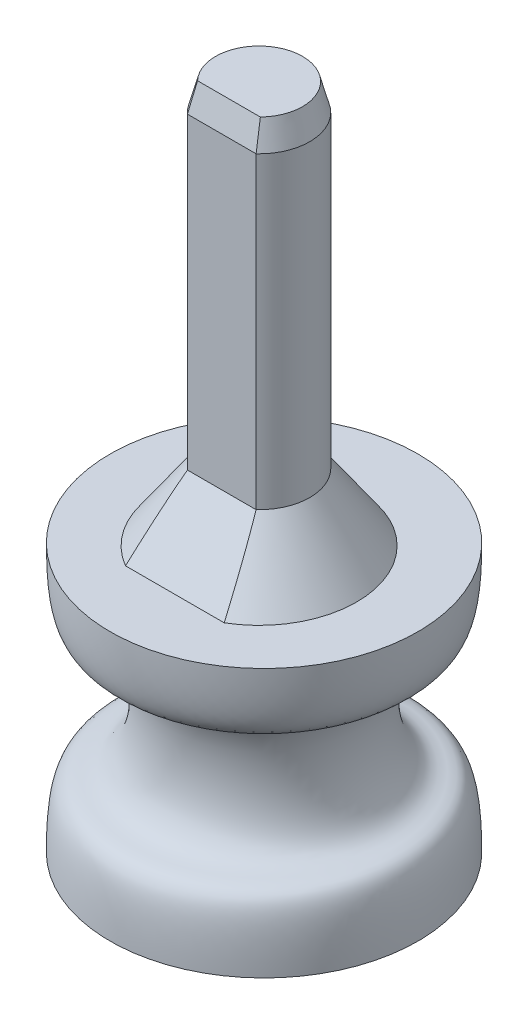
ISO-10303-21;
HEADER;
FILE_DESCRIPTION(('STEP AP214'),'2;1');
FILE_NAME('part.step','',(''),(''),'','','');
FILE_SCHEMA(('AUTOMOTIVE_DESIGN { 1 0 10303 214 1 1 1 1 }'));
ENDSEC;
DATA;
#1=APPLICATION_CONTEXT('core data for automotive mechanical design processes');
#2=APPLICATION_PROTOCOL_DEFINITION('international standard','automotive_design',2000,#1);
#3=PRODUCT_CONTEXT('',#1,'mechanical');
#4=PRODUCT('Part','Part','',(#3));
#5=PRODUCT_RELATED_PRODUCT_CATEGORY('part','',(#4));
#6=PRODUCT_DEFINITION_FORMATION('','',#4);
#7=PRODUCT_DEFINITION_CONTEXT('part definition',#1,'design');
#8=PRODUCT_DEFINITION('design','',#6,#7);
#9=PRODUCT_DEFINITION_SHAPE('','',#8);
#10=(LENGTH_UNIT() NAMED_UNIT(*) SI_UNIT(.MILLI.,.METRE.));
#11=(NAMED_UNIT(*) PLANE_ANGLE_UNIT() SI_UNIT($,.RADIAN.));
#12=(NAMED_UNIT(*) SI_UNIT($,.STERADIAN.) SOLID_ANGLE_UNIT());
#13=UNCERTAINTY_MEASURE_WITH_UNIT(LENGTH_MEASURE(1.E-05),#10,'distance_accuracy_value','');
#14=(GEOMETRIC_REPRESENTATION_CONTEXT(3) GLOBAL_UNCERTAINTY_ASSIGNED_CONTEXT((#13)) GLOBAL_UNIT_ASSIGNED_CONTEXT((#10,
#11,#12)) REPRESENTATION_CONTEXT('',''));
#15=CARTESIAN_POINT('',(0.,0.,0.));
#16=DIRECTION('',(0.,0.,1.));
#17=DIRECTION('',(1.,0.,0.));
#18=AXIS2_PLACEMENT_3D('',#15,#16,#17);
#19=CARTESIAN_POINT('',(0.,20.,0.));
#20=DIRECTION('',(0.,-1.,0.));
#21=DIRECTION('',(0.,0.,-1.));
#22=AXIS2_PLACEMENT_3D('',#19,#20,#21);
#23=CYLINDRICAL_SURFACE('',#22,2.27);
#24=DIRECTION('',(0.,-1.,0.));
#25=VECTOR('',#24,1.);
#26=CARTESIAN_POINT('',(1.53753048750261,20.,1.67));
#27=LINE('',#26,#25);
#28=CARTESIAN_POINT('',(1.53753048750261,18.8,1.67));
#29=VERTEX_POINT('',#28);
#30=CARTESIAN_POINT('',(1.53753048750261,4.99999999999998,1.67));
#31=VERTEX_POINT('',#30);
#32=EDGE_CURVE('E182',#29,#31,#27,.T.);
#33=ORIENTED_EDGE('',*,*,#32,.T.);
#34=CARTESIAN_POINT('',(0.,4.99999999999998,0.));
#35=DIRECTION('',(0.,-1.,0.));
#36=DIRECTION('',(0.,0.,-1.));
#37=AXIS2_PLACEMENT_3D('',#34,#35,#36);
#38=CIRCLE('',#37,2.27);
#39=CARTESIAN_POINT('',(-1.53753048750261,4.99999999999998,1.67));
#40=VERTEX_POINT('',#39);
#41=EDGE_CURVE('E11',#31,#40,#38,.F.);
#42=ORIENTED_EDGE('',*,*,#41,.T.);
#43=DIRECTION('',(0.,-1.,0.));
#44=VECTOR('',#43,1.);
#45=CARTESIAN_POINT('',(-1.53753048750261,20.,1.67));
#46=LINE('',#45,#44);
#47=CARTESIAN_POINT('',(-1.53753048750261,18.8,1.67));
#48=VERTEX_POINT('',#47);
#49=EDGE_CURVE('E116',#48,#40,#46,.T.);
#50=ORIENTED_EDGE('',*,*,#49,.F.);
#51=CARTESIAN_POINT('',(0.,18.8,0.));
#52=DIRECTION('',(0.,-1.,0.));
#53=DIRECTION('',(0.,0.,-1.));
#54=AXIS2_PLACEMENT_3D('',#51,#52,#53);
#55=CIRCLE('',#54,2.27);
#56=EDGE_CURVE('E122',#48,#29,#55,.T.);
#57=ORIENTED_EDGE('',*,*,#56,.T.);
#58=EDGE_LOOP('',(#33,#42,#50,#57));
#59=FACE_BOUND('',#58,.T.);
#60=ADVANCED_FACE('F47',(#59),#23,.T.);
#61=CARTESIAN_POINT('',(-1.53753048750261,20.,1.67));
#62=DIRECTION('',(0.,0.,-1.));
#63=DIRECTION('',(-1.,0.,0.));
#64=AXIS2_PLACEMENT_3D('',#61,#62,#63);
#65=PLANE('',#64);
#66=ORIENTED_EDGE('',*,*,#49,.T.);
#67=DIRECTION('',(1.,0.,0.));
#68=VECTOR('',#67,1.);
#69=CARTESIAN_POINT('',(1.53753048750261,4.99999999999998,1.67));
#70=LINE('',#69,#68);
#71=EDGE_CURVE('E63',#40,#31,#70,.T.);
#72=ORIENTED_EDGE('',*,*,#71,.T.);
#73=ORIENTED_EDGE('',*,*,#32,.F.);
#74=DIRECTION('',(-1.,0.,0.));
#75=VECTOR('',#74,1.);
#76=CARTESIAN_POINT('',(-1.53753048750261,18.8,1.67));
#77=LINE('',#76,#75);
#78=EDGE_CURVE('E104',#29,#48,#77,.T.);
#79=ORIENTED_EDGE('',*,*,#78,.T.);
#80=EDGE_LOOP('',(#66,#72,#73,#79));
#81=FACE_BOUND('',#80,.T.);
#82=ADVANCED_FACE('F181',(#81),#65,.F.);
#83=CARTESIAN_POINT('',(0.,20.,0.));
#84=DIRECTION('',(0.,-1.,0.));
#85=DIRECTION('',(0.,0.,-1.));
#86=AXIS2_PLACEMENT_3D('',#83,#84,#85);
#87=PLANE('',#86);
#88=CARTESIAN_POINT('',(0.,20.,0.));
#89=DIRECTION('',(0.,-1.,0.));
#90=DIRECTION('',(0.,0.,-1.));
#91=AXIS2_PLACEMENT_3D('',#88,#89,#90);
#92=CIRCLE('',#91,1.94846096908265);
#93=CARTESIAN_POINT('',(1.40646832986,20.,1.34846096908265));
#94=VERTEX_POINT('',#93);
#95=CARTESIAN_POINT('',(-1.40646832986,20.,1.34846096908265));
#96=VERTEX_POINT('',#95);
#97=EDGE_CURVE('E112',#94,#96,#92,.F.);
#98=ORIENTED_EDGE('',*,*,#97,.T.);
#99=DIRECTION('',(1.,0.,0.));
#100=VECTOR('',#99,1.);
#101=CARTESIAN_POINT('',(0.,20.,1.34846096908265));
#102=LINE('',#101,#100);
#103=EDGE_CURVE('E102',#96,#94,#102,.T.);
#104=ORIENTED_EDGE('',*,*,#103,.T.);
#105=EDGE_LOOP('',(#98,#104));
#106=FACE_BOUND('',#105,.T.);
#107=ADVANCED_FACE('F118',(#106),#87,.F.);
#108=CARTESIAN_POINT('',(0.,20.,0.));
#109=DIRECTION('',(0.,-1.,0.));
#110=DIRECTION('',(0.,0.,-1.));
#111=AXIS2_PLACEMENT_3D('',#108,#109,#110);
#112=CONICAL_SURFACE('',#111,1.94846096908265,0.261799387799146);
#113=CARTESIAN_POINT('',(1.40646832986,20.,1.34846096908265));
#114=CARTESIAN_POINT('',(1.42927330927061,19.800097874091,1.40202458228524));
#115=CARTESIAN_POINT('',(1.45159764973818,19.6001467700095,1.45560131914958));
#116=CARTESIAN_POINT('',(1.49528503482875,19.200146769929,1.5627809961436));
#117=CARTESIAN_POINT('',(1.51664808024205,19.0000978740104,1.61638393625172));
#118=CARTESIAN_POINT('',(1.53753048750261,18.8,1.67));
#119=B_SPLINE_CURVE_WITH_KNOTS('',3,(#113,#114,#115,#116,#117,#118),.UNSPECIFIED.,.F.,.F.,(4,2,
4),(0.,0.62461474718706,1.24922898085632),.UNSPECIFIED.);
#120=EDGE_CURVE('E98',#29,#94,#119,.F.);
#121=ORIENTED_EDGE('',*,*,#120,.F.);
#122=ORIENTED_EDGE('',*,*,#56,.F.);
#123=CARTESIAN_POINT('',(-1.53753048750261,18.8,1.67));
#124=CARTESIAN_POINT('',(-1.51664808024205,19.0000978740104,1.61638393625172));
#125=CARTESIAN_POINT('',(-1.49528503482875,19.200146769929,1.5627809961436));
#126=CARTESIAN_POINT('',(-1.45159764973818,19.6001467700095,1.45560131914958));
#127=CARTESIAN_POINT('',(-1.42927330927061,19.800097874091,1.40202458228524));
#128=CARTESIAN_POINT('',(-1.40646832986,20.,1.34846096908265));
#129=B_SPLINE_CURVE_WITH_KNOTS('',3,(#123,#124,#125,#126,#127,#128),.UNSPECIFIED.,.F.,.F.,(4,2,
4),(0.,0.624614233669259,1.24922898085632),.UNSPECIFIED.);
#130=EDGE_CURVE('E108',#96,#48,#129,.F.);
#131=ORIENTED_EDGE('',*,*,#130,.F.);
#132=ORIENTED_EDGE('',*,*,#97,.F.);
#133=EDGE_LOOP('',(#121,#122,#131,#132));
#134=FACE_BOUND('',#133,.T.);
#135=ADVANCED_FACE('F113',(#134),#112,.T.);
#136=CARTESIAN_POINT('',(0.,20.,1.34846096908265));
#137=DIRECTION('',(0.,-0.258819045102518,-0.965925826289069));
#138=DIRECTION('',(1.,0.,0.));
#139=AXIS2_PLACEMENT_3D('',#136,#137,#138);
#140=PLANE('',#139);
#141=ORIENTED_EDGE('',*,*,#130,.T.);
#142=ORIENTED_EDGE('',*,*,#78,.F.);
#143=ORIENTED_EDGE('',*,*,#120,.T.);
#144=ORIENTED_EDGE('',*,*,#103,.F.);
#145=EDGE_LOOP('',(#141,#142,#143,#144));
#146=FACE_BOUND('',#145,.T.);
#147=ADVANCED_FACE('F100',(#146),#140,.F.);
#148=CARTESIAN_POINT('',(0.,2.,1.67));
#149=DIRECTION('',(0.,-1.,0.));
#150=DIRECTION('',(0.,0.,-1.));
#151=AXIS2_PLACEMENT_3D('',#148,#149,#150);
#152=PLANE('',#151);
#153=CARTESIAN_POINT('',(0.,2.,0.));
#154=DIRECTION('',(0.,-1.,0.));
#155=DIRECTION('',(0.,0.,-1.));
#156=AXIS2_PLACEMENT_3D('',#153,#154,#155);
#157=CIRCLE('',#156,4.37062261462914);
#158=CARTESIAN_POINT('',(-2.21014640636202,2.,3.77062261462914));
#159=VERTEX_POINT('',#158);
#160=CARTESIAN_POINT('',(2.21014640636202,2.,3.77062261462914));
#161=VERTEX_POINT('',#160);
#162=EDGE_CURVE('E127',#159,#161,#157,.T.);
#163=ORIENTED_EDGE('',*,*,#162,.T.);
#164=DIRECTION('',(-1.,0.,0.));
#165=VECTOR('',#164,1.);
#166=CARTESIAN_POINT('',(-1.53753048750261,2.,3.77062261462914));
#167=LINE('',#166,#165);
#168=EDGE_CURVE('E169',#161,#159,#167,.T.);
#169=ORIENTED_EDGE('',*,*,#168,.T.);
#170=EDGE_LOOP('',(#163,#169));
#171=FACE_BOUND('',#170,.T.);
#172=CARTESIAN_POINT('',(0.,2.,-0.223266571014752));
#173=DIRECTION('',(0.,-1.,0.));
#174=DIRECTION('',(0.,0.,-1.));
#175=AXIS2_PLACEMENT_3D('',#172,#173,#174);
#176=CIRCLE('',#175,6.89326657101475);
#177=CARTESIAN_POINT('',(0.,2.,-7.1165331420295));
#178=VERTEX_POINT('',#177);
#179=EDGE_CURVE('E178',#178,#178,#176,.T.);
#180=ORIENTED_EDGE('',*,*,#179,.F.);
#181=EDGE_LOOP('',(#180));
#182=FACE_BOUND('',#181,.T.);
#183=ADVANCED_FACE('F148',(#171,#182),#152,.F.);
#184=CARTESIAN_POINT('',(0.,-10.,6.67));
#185=DIRECTION('',(0.,1.,0.));
#186=DIRECTION('',(0.,0.,1.));
#187=AXIS2_PLACEMENT_3D('',#184,#185,#186);
#188=PLANE('',#187);
#189=CARTESIAN_POINT('',(0.,-10.,-0.223266571014752));
#190=DIRECTION('',(0.,-1.,0.));
#191=DIRECTION('',(0.,0.,-1.));
#192=AXIS2_PLACEMENT_3D('',#189,#190,#191);
#193=CIRCLE('',#192,6.89326657101475);
#194=CARTESIAN_POINT('',(0.,-10.,-7.1165331420295));
#195=VERTEX_POINT('',#194);
#196=EDGE_CURVE('E109',#195,#195,#193,.T.);
#197=ORIENTED_EDGE('',*,*,#196,.T.);
#198=EDGE_LOOP('',(#197));
#199=FACE_BOUND('',#198,.T.);
#200=ADVANCED_FACE('F204',(#199),#188,.F.);
#201=CARTESIAN_POINT('',(0.,2.,6.67));
#202=CARTESIAN_POINT('',(0.,-7.84675153239116,6.67));
#203=CARTESIAN_POINT('',(0.,12.1481587445611,2.452738959521));
#204=CARTESIAN_POINT('',(0.,-20.1481587445611,2.452738959521));
#205=CARTESIAN_POINT('',(0.,-0.153248467608839,6.67));
#206=CARTESIAN_POINT('',(0.,-10.,6.67));
#207=B_SPLINE_CURVE_WITH_KNOTS('',5,(#201,#202,#203,#204,#205,#206),.UNSPECIFIED.,.F.,.F.,(6,6),
(0.,1.),.UNSPECIFIED.);
#208=CARTESIAN_POINT('',(0.,-10.,-0.223266571014752));
#209=DIRECTION('',(0.,-1.,0.));
#210=AXIS1_PLACEMENT('',#208,#209);
#211=SURFACE_OF_REVOLUTION('',#207,#210);
#212=ORIENTED_EDGE('',*,*,#196,.F.);
#213=EDGE_LOOP('',(#212));
#214=FACE_BOUND('',#213,.T.);
#215=ORIENTED_EDGE('',*,*,#179,.T.);
#216=EDGE_LOOP('',(#215));
#217=FACE_BOUND('',#216,.T.);
#218=ADVANCED_FACE('F156',(#214,#217),#211,.T.);
#219=CARTESIAN_POINT('',(0.,2.,0.));
#220=DIRECTION('',(0.,-1.,0.));
#221=DIRECTION('',(0.,0.,-1.));
#222=AXIS2_PLACEMENT_3D('',#219,#220,#221);
#223=CONICAL_SURFACE('',#222,4.37062261462914,0.610865238198021);
#224=CARTESIAN_POINT('',(-2.21014640636202,2.,3.77062261462914));
#225=CARTESIAN_POINT('',(-2.16234635838094,2.25119312455575,3.59473529526875));
#226=CARTESIAN_POINT('',(-2.11312873292283,2.5022132666935,3.41896909950142));
#227=CARTESIAN_POINT('',(-2.01098772157026,3.00368073171149,3.06783780032891));
#228=CARTESIAN_POINT('',(-1.95806527068591,3.25412818276598,2.89247260717514));
#229=CARTESIAN_POINT('',(-1.84761025911083,3.754397882247,2.54217999246062));
#230=CARTESIAN_POINT('',(-1.79007681617256,4.00422000155027,2.36725266131295));
#231=CARTESIAN_POINT('',(-1.69921924426601,4.37824356871078,2.10535854011907));
#232=CARTESIAN_POINT('',(-1.66816958321014,4.50281560916574,2.01813225834234));
#233=CARTESIAN_POINT('',(-1.60427022902932,4.75165405173582,1.8438937050584));
#234=CARTESIAN_POINT('',(-1.57142046661008,4.87592044189237,1.75688144192468));
#235=CARTESIAN_POINT('',(-1.53753048750269,4.99999999999999,1.66999999999999));
#236=B_SPLINE_CURVE_WITH_KNOTS('',3,(#224,#225,#226,#227,#228,#229,#230,#231,#232,#233,#234,
#235),.UNSPECIFIED.,.F.,.F.,(4,2,2,2,2,4),(0.,0.931070354281541,1.86190656977171,
2.79292131464983,3.25854705455393,3.72419073116866),.UNSPECIFIED.);
#237=EDGE_CURVE('E159',#40,#159,#236,.F.);
#238=ORIENTED_EDGE('',*,*,#237,.F.);
#239=ORIENTED_EDGE('',*,*,#41,.F.);
#240=CARTESIAN_POINT('',(1.53753048750261,4.99999999999998,1.67));
#241=CARTESIAN_POINT('',(1.59002091408286,4.8076204778553,1.80470559160289));
#242=CARTESIAN_POINT('',(1.6400923337367,4.61481265381543,1.93971108342142));
#243=CARTESIAN_POINT('',(1.73625657494795,4.22854695895065,2.21017723471755));
#244=CARTESIAN_POINT('',(1.78234972623209,4.03508914338176,2.34563785550447));
#245=CARTESIAN_POINT('',(1.87141087755663,3.64776062901613,2.61684820102686));
#246=CARTESIAN_POINT('',(1.91437988263377,3.45389008383721,2.75259781819797));
#247=CARTESIAN_POINT('',(1.9977417837498,3.06577516480998,3.02435881019249));
#248=CARTESIAN_POINT('',(2.03813463879402,2.87153078506343,3.16037018914589));
#249=CARTESIAN_POINT('',(2.10024884540746,2.56438033848634,3.37543924720365));
#250=CARTESIAN_POINT('',(2.12268802012058,2.45157103629635,3.45442917097726));
#251=CARTESIAN_POINT('',(2.16690135282658,2.22585404808692,3.6124779076235));
#252=CARTESIAN_POINT('',(2.18867544780334,2.11294635378088,3.69153672629847));
#253=CARTESIAN_POINT('',(2.21014640636379,2.00000000000024,3.77062261462897));
#254=B_SPLINE_CURVE_WITH_KNOTS('',3,(#240,#241,#242,#243,#244,#245,#246,#247,#248,#249,#250,
#251,#252,#253),.UNSPECIFIED.,.F.,.F.,(4,2,2,2,2,2,4),(0.,0.721901678912564,1.4437434676188,
2.1653520030802,2.88697201874776,3.30556324913447,3.72419401866967),.UNSPECIFIED.);
#255=EDGE_CURVE('E53',#161,#31,#254,.F.);
#256=ORIENTED_EDGE('',*,*,#255,.F.);
#257=ORIENTED_EDGE('',*,*,#162,.F.);
#258=EDGE_LOOP('',(#238,#239,#256,#257));
#259=FACE_BOUND('',#258,.T.);
#260=ADVANCED_FACE('F150',(#259),#223,.T.);
#261=CARTESIAN_POINT('',(0.,2.,3.77062261462914));
#262=DIRECTION('',(0.,0.573576436351051,0.819152044288989));
#263=DIRECTION('',(1.,0.,0.));
#264=AXIS2_PLACEMENT_3D('',#261,#262,#263);
#265=PLANE('',#264);
#266=ORIENTED_EDGE('',*,*,#255,.T.);
#267=ORIENTED_EDGE('',*,*,#71,.F.);
#268=ORIENTED_EDGE('',*,*,#237,.T.);
#269=ORIENTED_EDGE('',*,*,#168,.F.);
#270=EDGE_LOOP('',(#266,#267,#268,#269));
#271=FACE_BOUND('',#270,.T.);
#272=ADVANCED_FACE('F50',(#271),#265,.T.);
#273=CLOSED_SHELL('',(#60,#82,#107,#135,#147,#183,#200,#218,#260,#272));
#274=MANIFOLD_SOLID_BREP('B2',#273);
#275=ADVANCED_BREP_SHAPE_REPRESENTATION('',(#18,#274),#14);
#276=SHAPE_DEFINITION_REPRESENTATION(#9,#275);
ENDSEC;
END-ISO-10303-21;
